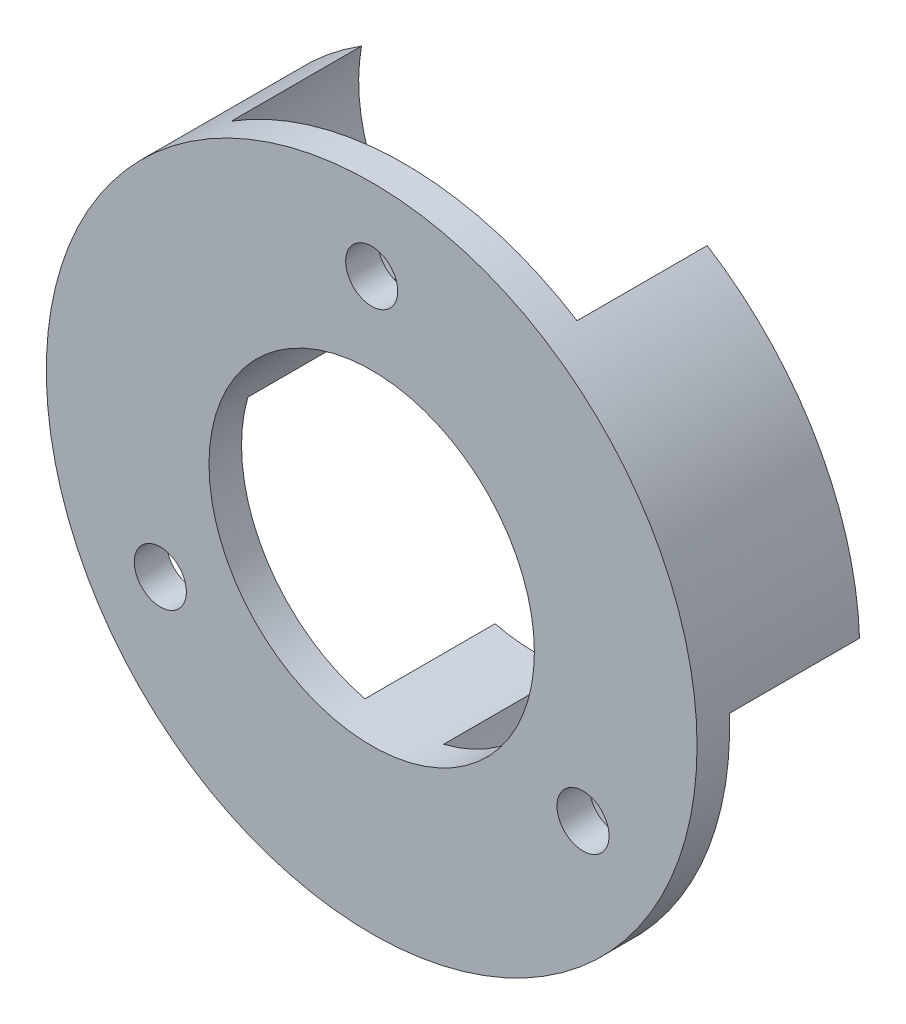
ISO-10303-21;
HEADER;
FILE_DESCRIPTION(('STEP AP214'),'2;1');
FILE_NAME('part.step','',(''),(''),'','','');
FILE_SCHEMA(('AUTOMOTIVE_DESIGN { 1 0 10303 214 1 1 1 1 }'));
ENDSEC;
DATA;
#1=APPLICATION_CONTEXT('core data for automotive mechanical design processes');
#2=APPLICATION_PROTOCOL_DEFINITION('international standard','automotive_design',2000,#1);
#3=PRODUCT_CONTEXT('',#1,'mechanical');
#4=PRODUCT('Part','Part','',(#3));
#5=PRODUCT_RELATED_PRODUCT_CATEGORY('part','',(#4));
#6=PRODUCT_DEFINITION_FORMATION('','',#4);
#7=PRODUCT_DEFINITION_CONTEXT('part definition',#1,'design');
#8=PRODUCT_DEFINITION('design','',#6,#7);
#9=PRODUCT_DEFINITION_SHAPE('','',#8);
#10=(LENGTH_UNIT() NAMED_UNIT(*) SI_UNIT(.MILLI.,.METRE.));
#11=(NAMED_UNIT(*) PLANE_ANGLE_UNIT() SI_UNIT($,.RADIAN.));
#12=(NAMED_UNIT(*) SI_UNIT($,.STERADIAN.) SOLID_ANGLE_UNIT());
#13=UNCERTAINTY_MEASURE_WITH_UNIT(LENGTH_MEASURE(1.E-05),#10,'distance_accuracy_value','');
#14=(GEOMETRIC_REPRESENTATION_CONTEXT(3) GLOBAL_UNCERTAINTY_ASSIGNED_CONTEXT((#13)) GLOBAL_UNIT_ASSIGNED_CONTEXT((#10,
#11,#12)) REPRESENTATION_CONTEXT('',''));
#15=CARTESIAN_POINT('',(0.,0.,0.));
#16=DIRECTION('',(0.,0.,1.));
#17=DIRECTION('',(1.,0.,0.));
#18=AXIS2_PLACEMENT_3D('',#15,#16,#17);
#19=CARTESIAN_POINT('',(0.,0.,0.));
#20=DIRECTION('',(0.,0.,1.));
#21=DIRECTION('',(1.,0.,0.));
#22=AXIS2_PLACEMENT_3D('',#19,#20,#21);
#23=PLANE('',#22);
#24=CARTESIAN_POINT('',(1.09461051334137E-12,18.75,0.));
#25=DIRECTION('',(0.,0.,-1.));
#26=DIRECTION('',(-1.,0.,0.));
#27=AXIS2_PLACEMENT_3D('',#24,#25,#26);
#28=CIRCLE('',#27,2.);
#29=CARTESIAN_POINT('',(-1.99999999999891,18.75,0.));
#30=VERTEX_POINT('',#29);
#31=EDGE_CURVE('E314',#30,#30,#28,.T.);
#32=ORIENTED_EDGE('',*,*,#31,.F.);
#33=EDGE_LOOP('',(#32));
#34=FACE_BOUND('',#33,.T.);
#35=CARTESIAN_POINT('',(1.09807996029332E-12,18.7499999999993,0.));
#36=DIRECTION('',(0.,0.,-1.));
#37=DIRECTION('',(-1.,0.,0.));
#38=AXIS2_PLACEMENT_3D('',#35,#36,#37);
#39=CIRCLE('',#38,13.5);
#40=CARTESIAN_POINT('',(13.2791941480743,21.181666666666,0.));
#41=VERTEX_POINT('',#40);
#42=CARTESIAN_POINT('',(8.9932565786207,8.68166666666577,0.));
#43=VERTEX_POINT('',#42);
#44=EDGE_CURVE('E139',#41,#43,#39,.T.);
#45=ORIENTED_EDGE('',*,*,#44,.T.);
#46=CARTESIAN_POINT('',(0.,0.,0.));
#47=DIRECTION('',(0.,0.,-1.));
#48=DIRECTION('',(-1.,0.,0.));
#49=AXIS2_PLACEMENT_3D('',#46,#47,#48);
#50=CIRCLE('',#49,12.5);
#51=CARTESIAN_POINT('',(-8.99325657861969,8.68166666666682,0.));
#52=VERTEX_POINT('',#51);
#53=EDGE_CURVE('E132',#52,#43,#50,.T.);
#54=ORIENTED_EDGE('',*,*,#53,.F.);
#55=CARTESIAN_POINT('',(1.09807996029332E-12,18.7499999999993,0.));
#56=DIRECTION('',(0.,0.,-1.));
#57=DIRECTION('',(-1.,0.,0.));
#58=AXIS2_PLACEMENT_3D('',#55,#56,#57);
#59=CIRCLE('',#58,13.5);
#60=CARTESIAN_POINT('',(-13.2791941480718,21.1816666666675,0.));
#61=VERTEX_POINT('',#60);
#62=EDGE_CURVE('E136',#52,#61,#59,.T.);
#63=ORIENTED_EDGE('',*,*,#62,.T.);
#64=CARTESIAN_POINT('',(0.,0.,0.));
#65=DIRECTION('',(0.,0.,1.));
#66=DIRECTION('',(1.,0.,0.));
#67=AXIS2_PLACEMENT_3D('',#64,#65,#66);
#68=CIRCLE('',#67,25.);
#69=EDGE_CURVE('E48',#41,#61,#68,.T.);
#70=ORIENTED_EDGE('',*,*,#69,.F.);
#71=EDGE_LOOP('',(#45,#54,#63,#70));
#72=FACE_BOUND('',#71,.T.);
#73=ADVANCED_FACE('F39',(#34,#72),#23,.F.);
#74=CARTESIAN_POINT('',(-16.2379763209587,-9.37499999999912,0.));
#75=DIRECTION('',(0.,0.,-1.));
#76=DIRECTION('',(-1.,0.,0.));
#77=AXIS2_PLACEMENT_3D('',#74,#75,#76);
#78=CIRCLE('',#77,2.);
#79=CARTESIAN_POINT('',(-18.2379763209587,-9.37499999999912,0.));
#80=VERTEX_POINT('',#79);
#81=EDGE_CURVE('E317',#80,#80,#78,.T.);
#82=ORIENTED_EDGE('',*,*,#81,.F.);
#83=EDGE_LOOP('',(#82));
#84=FACE_BOUND('',#83,.T.);
#85=CARTESIAN_POINT('',(-16.2379763209581,-9.37499999999878,0.));
#86=DIRECTION('',(0.,0.,-1.));
#87=DIRECTION('',(-1.,0.,0.));
#88=AXIS2_PLACEMENT_3D('',#85,#86,#87);
#89=CIRCLE('',#88,13.5);
#90=CARTESIAN_POINT('',(-24.983458501864,0.909286140684916,0.));
#91=VERTEX_POINT('',#90);
#92=CARTESIAN_POINT('',(-12.0151721698315,3.44755532650411,0.));
#93=VERTEX_POINT('',#92);
#94=EDGE_CURVE('E56',#91,#93,#89,.T.);
#95=ORIENTED_EDGE('',*,*,#94,.T.);
#96=CARTESIAN_POINT('',(-3.02191559121215,-12.1292219931696,0.));
#97=VERTEX_POINT('',#96);
#98=EDGE_CURVE('E145',#97,#93,#50,.T.);
#99=ORIENTED_EDGE('',*,*,#98,.F.);
#100=CARTESIAN_POINT('',(-16.2379763209581,-9.37499999999878,0.));
#101=DIRECTION('',(0.,0.,-1.));
#102=DIRECTION('',(-1.,0.,0.));
#103=AXIS2_PLACEMENT_3D('',#100,#101,#102);
#104=CIRCLE('',#103,13.5);
#105=CARTESIAN_POINT('',(-11.7042643537921,-22.0909528073497,0.));
#106=VERTEX_POINT('',#105);
#107=EDGE_CURVE('E178',#97,#106,#104,.T.);
#108=ORIENTED_EDGE('',*,*,#107,.T.);
#109=EDGE_CURVE('E224',#91,#106,#68,.T.);
#110=ORIENTED_EDGE('',*,*,#109,.F.);
#111=EDGE_LOOP('',(#95,#99,#108,#110));
#112=FACE_BOUND('',#111,.T.);
#113=ADVANCED_FACE('F282',(#84,#112),#23,.F.);
#114=CARTESIAN_POINT('',(16.2379763209576,-9.37500000000103,0.));
#115=DIRECTION('',(0.,0.,-1.));
#116=DIRECTION('',(-1.,0.,0.));
#117=AXIS2_PLACEMENT_3D('',#114,#115,#116);
#118=CIRCLE('',#117,2.);
#119=CARTESIAN_POINT('',(14.2379763209576,-9.37500000000103,0.));
#120=VERTEX_POINT('',#119);
#121=EDGE_CURVE('E229',#120,#120,#118,.T.);
#122=ORIENTED_EDGE('',*,*,#121,.F.);
#123=EDGE_LOOP('',(#122));
#124=FACE_BOUND('',#123,.T.);
#125=CARTESIAN_POINT('',(16.237976320957,-9.37500000000068,0.));
#126=DIRECTION('',(0.,0.,-1.));
#127=DIRECTION('',(-1.,0.,0.));
#128=AXIS2_PLACEMENT_3D('',#125,#126,#127);
#129=CIRCLE('',#128,13.5);
#130=CARTESIAN_POINT('',(11.7042643537895,-22.0909528073511,0.));
#131=VERTEX_POINT('',#130);
#132=CARTESIAN_POINT('',(3.02191559121072,-12.12922199317,0.));
#133=VERTEX_POINT('',#132);
#134=EDGE_CURVE('E64',#131,#133,#129,.T.);
#135=ORIENTED_EDGE('',*,*,#134,.T.);
#136=CARTESIAN_POINT('',(12.0151721698319,3.4475553265027,0.));
#137=VERTEX_POINT('',#136);
#138=EDGE_CURVE('E143',#137,#133,#50,.T.);
#139=ORIENTED_EDGE('',*,*,#138,.F.);
#140=CARTESIAN_POINT('',(16.237976320957,-9.37500000000068,0.));
#141=DIRECTION('',(0.,0.,-1.));
#142=DIRECTION('',(-1.,0.,0.));
#143=AXIS2_PLACEMENT_3D('',#140,#141,#142);
#144=CIRCLE('',#143,13.5);
#145=CARTESIAN_POINT('',(24.9834585018641,0.909286140681987,0.));
#146=VERTEX_POINT('',#145);
#147=EDGE_CURVE('E199',#137,#146,#144,.T.);
#148=ORIENTED_EDGE('',*,*,#147,.T.);
#149=EDGE_CURVE('E222',#131,#146,#68,.T.);
#150=ORIENTED_EDGE('',*,*,#149,.F.);
#151=EDGE_LOOP('',(#135,#139,#148,#150));
#152=FACE_BOUND('',#151,.T.);
#153=ADVANCED_FACE('F273',(#124,#152),#23,.F.);
#154=CARTESIAN_POINT('',(0.,0.,2.5));
#155=DIRECTION('',(0.,0.,-1.));
#156=DIRECTION('',(-1.,0.,0.));
#157=AXIS2_PLACEMENT_3D('',#154,#155,#156);
#158=CYLINDRICAL_SURFACE('',#157,25.);
#159=CARTESIAN_POINT('',(0.,0.,2.5));
#160=DIRECTION('',(0.,0.,1.));
#161=DIRECTION('',(1.,0.,0.));
#162=AXIS2_PLACEMENT_3D('',#159,#160,#161);
#163=CIRCLE('',#162,25.);
#164=CARTESIAN_POINT('',(25.,0.,2.5));
#165=VERTEX_POINT('',#164);
#166=EDGE_CURVE('E11',#165,#165,#163,.T.);
#167=ORIENTED_EDGE('',*,*,#166,.F.);
#168=EDGE_LOOP('',(#167));
#169=FACE_BOUND('',#168,.T.);
#170=ORIENTED_EDGE('',*,*,#69,.T.);
#171=DIRECTION('',(0.,0.,1.));
#172=VECTOR('',#171,1.);
#173=CARTESIAN_POINT('',(-13.2791941480718,21.1816666666675,-10.));
#174=LINE('',#173,#172);
#175=CARTESIAN_POINT('',(-13.2791941480718,21.1816666666675,-10.));
#176=VERTEX_POINT('',#175);
#177=EDGE_CURVE('E160',#176,#61,#174,.T.);
#178=ORIENTED_EDGE('',*,*,#177,.F.);
#179=CARTESIAN_POINT('',(0.,0.,-10.));
#180=DIRECTION('',(0.,0.,-1.));
#181=DIRECTION('',(-1.,0.,0.));
#182=AXIS2_PLACEMENT_3D('',#179,#180,#181);
#183=CIRCLE('',#182,25.);
#184=CARTESIAN_POINT('',(-24.983458501864,0.909286140684916,-10.));
#185=VERTEX_POINT('',#184);
#186=EDGE_CURVE('E167',#185,#176,#183,.T.);
#187=ORIENTED_EDGE('',*,*,#186,.F.);
#188=DIRECTION('',(0.,0.,1.));
#189=VECTOR('',#188,1.);
#190=CARTESIAN_POINT('',(-24.983458501864,0.909286140684916,-10.));
#191=LINE('',#190,#189);
#192=EDGE_CURVE('E171',#185,#91,#191,.T.);
#193=ORIENTED_EDGE('',*,*,#192,.T.);
#194=ORIENTED_EDGE('',*,*,#109,.T.);
#195=DIRECTION('',(0.,0.,1.));
#196=VECTOR('',#195,1.);
#197=CARTESIAN_POINT('',(-11.7042643537921,-22.0909528073497,-10.));
#198=LINE('',#197,#196);
#199=CARTESIAN_POINT('',(-11.7042643537921,-22.0909528073497,-10.));
#200=VERTEX_POINT('',#199);
#201=EDGE_CURVE('E192',#200,#106,#198,.T.);
#202=ORIENTED_EDGE('',*,*,#201,.F.);
#203=CARTESIAN_POINT('',(0.,0.,-10.));
#204=DIRECTION('',(0.,0.,-1.));
#205=DIRECTION('',(-1.,0.,0.));
#206=AXIS2_PLACEMENT_3D('',#203,#204,#205);
#207=CIRCLE('',#206,25.);
#208=CARTESIAN_POINT('',(11.7042643537895,-22.0909528073511,-10.));
#209=VERTEX_POINT('',#208);
#210=EDGE_CURVE('E181',#209,#200,#207,.T.);
#211=ORIENTED_EDGE('',*,*,#210,.F.);
#212=DIRECTION('',(0.,0.,1.));
#213=VECTOR('',#212,1.);
#214=CARTESIAN_POINT('',(11.7042643537895,-22.0909528073511,-10.));
#215=LINE('',#214,#213);
#216=EDGE_CURVE('E195',#209,#131,#215,.T.);
#217=ORIENTED_EDGE('',*,*,#216,.T.);
#218=ORIENTED_EDGE('',*,*,#149,.T.);
#219=DIRECTION('',(0.,0.,1.));
#220=VECTOR('',#219,1.);
#221=CARTESIAN_POINT('',(24.9834585018641,0.909286140681987,-10.));
#222=LINE('',#221,#220);
#223=CARTESIAN_POINT('',(24.9834585018641,0.909286140681987,-10.));
#224=VERTEX_POINT('',#223);
#225=EDGE_CURVE('E211',#224,#146,#222,.T.);
#226=ORIENTED_EDGE('',*,*,#225,.F.);
#227=CARTESIAN_POINT('',(0.,0.,-10.));
#228=DIRECTION('',(0.,0.,-1.));
#229=DIRECTION('',(-1.,0.,0.));
#230=AXIS2_PLACEMENT_3D('',#227,#228,#229);
#231=CIRCLE('',#230,25.);
#232=CARTESIAN_POINT('',(13.2791941480743,21.181666666666,-10.));
#233=VERTEX_POINT('',#232);
#234=EDGE_CURVE('E209',#233,#224,#231,.T.);
#235=ORIENTED_EDGE('',*,*,#234,.F.);
#236=DIRECTION('',(0.,0.,1.));
#237=VECTOR('',#236,1.);
#238=CARTESIAN_POINT('',(13.2791941480743,21.181666666666,-10.));
#239=LINE('',#238,#237);
#240=EDGE_CURVE('E217',#233,#41,#239,.T.);
#241=ORIENTED_EDGE('',*,*,#240,.T.);
#242=EDGE_LOOP('',(#170,#178,#187,#193,#194,#202,#211,#217,#218,#226,#235,#241));
#243=FACE_BOUND('',#242,.T.);
#244=ADVANCED_FACE('F41',(#169,#243),#158,.T.);
#245=CARTESIAN_POINT('',(0.,0.,2.5));
#246=DIRECTION('',(0.,0.,1.));
#247=DIRECTION('',(1.,0.,0.));
#248=AXIS2_PLACEMENT_3D('',#245,#246,#247);
#249=PLANE('',#248);
#250=CARTESIAN_POINT('',(16.2379763209576,-9.37500000000103,2.5));
#251=DIRECTION('',(0.,0.,1.));
#252=DIRECTION('',(1.,0.,0.));
#253=AXIS2_PLACEMENT_3D('',#250,#251,#252);
#254=CIRCLE('',#253,2.);
#255=CARTESIAN_POINT('',(18.2379763209576,-9.37500000000103,2.5));
#256=VERTEX_POINT('',#255);
#257=EDGE_CURVE('E43',#256,#256,#254,.T.);
#258=ORIENTED_EDGE('',*,*,#257,.F.);
#259=EDGE_LOOP('',(#258));
#260=FACE_BOUND('',#259,.T.);
#261=CARTESIAN_POINT('',(1.09461051334137E-12,18.75,2.5));
#262=DIRECTION('',(0.,0.,1.));
#263=DIRECTION('',(1.,0.,0.));
#264=AXIS2_PLACEMENT_3D('',#261,#262,#263);
#265=CIRCLE('',#264,2.);
#266=CARTESIAN_POINT('',(2.0000000000011,18.75,2.5));
#267=VERTEX_POINT('',#266);
#268=EDGE_CURVE('E228',#267,#267,#265,.T.);
#269=ORIENTED_EDGE('',*,*,#268,.F.);
#270=EDGE_LOOP('',(#269));
#271=FACE_BOUND('',#270,.T.);
#272=CARTESIAN_POINT('',(-16.2379763209587,-9.37499999999912,2.5));
#273=DIRECTION('',(0.,0.,1.));
#274=DIRECTION('',(1.,0.,0.));
#275=AXIS2_PLACEMENT_3D('',#272,#273,#274);
#276=CIRCLE('',#275,2.);
#277=CARTESIAN_POINT('',(-14.2379763209587,-9.37499999999912,2.5));
#278=VERTEX_POINT('',#277);
#279=EDGE_CURVE('E226',#278,#278,#276,.T.);
#280=ORIENTED_EDGE('',*,*,#279,.F.);
#281=EDGE_LOOP('',(#280));
#282=FACE_BOUND('',#281,.T.);
#283=CARTESIAN_POINT('',(0.,0.,2.5));
#284=DIRECTION('',(0.,0.,1.));
#285=DIRECTION('',(1.,0.,0.));
#286=AXIS2_PLACEMENT_3D('',#283,#284,#285);
#287=CIRCLE('',#286,12.5);
#288=CARTESIAN_POINT('',(12.5,0.,2.5));
#289=VERTEX_POINT('',#288);
#290=EDGE_CURVE('E142',#289,#289,#287,.T.);
#291=ORIENTED_EDGE('',*,*,#290,.F.);
#292=EDGE_LOOP('',(#291));
#293=FACE_BOUND('',#292,.T.);
#294=ORIENTED_EDGE('',*,*,#166,.T.);
#295=EDGE_LOOP('',(#294));
#296=FACE_BOUND('',#295,.T.);
#297=ADVANCED_FACE('F309',(#260,#271,#282,#293,#296),#249,.T.);
#298=CARTESIAN_POINT('',(16.237976320957,-9.37500000000068,-10.));
#299=DIRECTION('',(0.,0.,1.));
#300=DIRECTION('',(1.,0.,0.));
#301=AXIS2_PLACEMENT_3D('',#298,#299,#300);
#302=CYLINDRICAL_SURFACE('',#301,13.5);
#303=ORIENTED_EDGE('',*,*,#147,.F.);
#304=DIRECTION('',(0.,0.,1.));
#305=VECTOR('',#304,1.);
#306=CARTESIAN_POINT('',(12.0151721698319,3.4475553265027,-10.));
#307=LINE('',#306,#305);
#308=CARTESIAN_POINT('',(12.0151721698319,3.4475553265027,-10.));
#309=VERTEX_POINT('',#308);
#310=EDGE_CURVE('E221',#309,#137,#307,.T.);
#311=ORIENTED_EDGE('',*,*,#310,.F.);
#312=CARTESIAN_POINT('',(16.237976320957,-9.37500000000068,-10.));
#313=DIRECTION('',(0.,0.,-1.));
#314=DIRECTION('',(-1.,0.,0.));
#315=AXIS2_PLACEMENT_3D('',#312,#313,#314);
#316=CIRCLE('',#315,13.5);
#317=EDGE_CURVE('E200',#309,#224,#316,.T.);
#318=ORIENTED_EDGE('',*,*,#317,.T.);
#319=ORIENTED_EDGE('',*,*,#225,.T.);
#320=EDGE_LOOP('',(#303,#311,#318,#319));
#321=FACE_BOUND('',#320,.T.);
#322=ADVANCED_FACE('F267',(#321),#302,.F.);
#323=CARTESIAN_POINT('',(0.,0.,-10.));
#324=DIRECTION('',(0.,0.,1.));
#325=DIRECTION('',(1.,0.,0.));
#326=AXIS2_PLACEMENT_3D('',#323,#324,#325);
#327=CYLINDRICAL_SURFACE('',#326,12.5);
#328=ORIENTED_EDGE('',*,*,#310,.T.);
#329=ORIENTED_EDGE('',*,*,#138,.T.);
#330=DIRECTION('',(0.,0.,1.));
#331=VECTOR('',#330,1.);
#332=CARTESIAN_POINT('',(3.02191559121072,-12.12922199317,-10.));
#333=LINE('',#332,#331);
#334=CARTESIAN_POINT('',(3.02191559121072,-12.12922199317,-10.));
#335=VERTEX_POINT('',#334);
#336=EDGE_CURVE('E197',#335,#133,#333,.T.);
#337=ORIENTED_EDGE('',*,*,#336,.F.);
#338=CARTESIAN_POINT('',(0.,0.,-10.));
#339=DIRECTION('',(0.,0.,-1.));
#340=DIRECTION('',(-1.,0.,0.));
#341=AXIS2_PLACEMENT_3D('',#338,#339,#340);
#342=CIRCLE('',#341,12.5);
#343=CARTESIAN_POINT('',(-3.02191559121214,-12.1292219931696,-10.));
#344=VERTEX_POINT('',#343);
#345=EDGE_CURVE('E174',#335,#344,#342,.T.);
#346=ORIENTED_EDGE('',*,*,#345,.T.);
#347=DIRECTION('',(0.,0.,1.));
#348=VECTOR('',#347,1.);
#349=CARTESIAN_POINT('',(-3.02191559121214,-12.1292219931696,-10.));
#350=LINE('',#349,#348);
#351=EDGE_CURVE('E186',#344,#97,#350,.T.);
#352=ORIENTED_EDGE('',*,*,#351,.T.);
#353=ORIENTED_EDGE('',*,*,#98,.T.);
#354=DIRECTION('',(0.,0.,1.));
#355=VECTOR('',#354,1.);
#356=CARTESIAN_POINT('',(-12.0151721698315,3.44755532650411,-10.));
#357=LINE('',#356,#355);
#358=CARTESIAN_POINT('',(-12.0151721698315,3.44755532650411,-10.));
#359=VERTEX_POINT('',#358);
#360=EDGE_CURVE('E156',#359,#93,#357,.T.);
#361=ORIENTED_EDGE('',*,*,#360,.F.);
#362=CARTESIAN_POINT('',(0.,0.,-10.));
#363=DIRECTION('',(0.,0.,-1.));
#364=DIRECTION('',(-1.,0.,0.));
#365=AXIS2_PLACEMENT_3D('',#362,#363,#364);
#366=CIRCLE('',#365,12.5);
#367=CARTESIAN_POINT('',(-8.99325657861968,8.68166666666682,-10.));
#368=VERTEX_POINT('',#367);
#369=EDGE_CURVE('E152',#359,#368,#366,.T.);
#370=ORIENTED_EDGE('',*,*,#369,.T.);
#371=DIRECTION('',(0.,0.,1.));
#372=VECTOR('',#371,1.);
#373=CARTESIAN_POINT('',(-8.99325657861968,8.68166666666682,-10.));
#374=LINE('',#373,#372);
#375=EDGE_CURVE('E147',#368,#52,#374,.T.);
#376=ORIENTED_EDGE('',*,*,#375,.T.);
#377=ORIENTED_EDGE('',*,*,#53,.T.);
#378=DIRECTION('',(0.,0.,1.));
#379=VECTOR('',#378,1.);
#380=CARTESIAN_POINT('',(8.99325657862071,8.68166666666577,-10.));
#381=LINE('',#380,#379);
#382=CARTESIAN_POINT('',(8.99325657862071,8.68166666666577,-10.));
#383=VERTEX_POINT('',#382);
#384=EDGE_CURVE('E219',#383,#43,#381,.T.);
#385=ORIENTED_EDGE('',*,*,#384,.F.);
#386=CARTESIAN_POINT('',(0.,0.,-10.));
#387=DIRECTION('',(0.,0.,-1.));
#388=DIRECTION('',(-1.,0.,0.));
#389=AXIS2_PLACEMENT_3D('',#386,#387,#388);
#390=CIRCLE('',#389,12.5);
#391=EDGE_CURVE('E203',#383,#309,#390,.T.);
#392=ORIENTED_EDGE('',*,*,#391,.T.);
#393=EDGE_LOOP('',(#328,#329,#337,#346,#352,#353,#361,#370,#376,#377,#385,#392));
#394=FACE_BOUND('',#393,.T.);
#395=ORIENTED_EDGE('',*,*,#290,.T.);
#396=EDGE_LOOP('',(#395));
#397=FACE_BOUND('',#396,.T.);
#398=ADVANCED_FACE('F149',(#394,#397),#327,.F.);
#399=CARTESIAN_POINT('',(1.09807996029332E-12,18.7499999999993,-10.));
#400=DIRECTION('',(0.,0.,1.));
#401=DIRECTION('',(1.,0.,0.));
#402=AXIS2_PLACEMENT_3D('',#399,#400,#401);
#403=CYLINDRICAL_SURFACE('',#402,13.5);
#404=ORIENTED_EDGE('',*,*,#44,.F.);
#405=ORIENTED_EDGE('',*,*,#240,.F.);
#406=CARTESIAN_POINT('',(1.09807996029332E-12,18.7499999999993,-10.));
#407=DIRECTION('',(0.,0.,-1.));
#408=DIRECTION('',(-1.,0.,0.));
#409=AXIS2_PLACEMENT_3D('',#406,#407,#408);
#410=CIRCLE('',#409,13.5);
#411=EDGE_CURVE('E206',#233,#383,#410,.T.);
#412=ORIENTED_EDGE('',*,*,#411,.T.);
#413=ORIENTED_EDGE('',*,*,#384,.T.);
#414=EDGE_LOOP('',(#404,#405,#412,#413));
#415=FACE_BOUND('',#414,.T.);
#416=ADVANCED_FACE('F260',(#415),#403,.F.);
#417=CARTESIAN_POINT('',(0.,0.,-10.));
#418=DIRECTION('',(0.,0.,-1.));
#419=DIRECTION('',(-1.,0.,0.));
#420=AXIS2_PLACEMENT_3D('',#417,#418,#419);
#421=PLANE('',#420);
#422=CARTESIAN_POINT('',(16.2379763209588,9.37499999999819,-10.));
#423=DIRECTION('',(0.,0.,-1.));
#424=DIRECTION('',(-1.,0.,0.));
#425=AXIS2_PLACEMENT_3D('',#422,#423,#424);
#426=CIRCLE('',#425,2.00000000000066);
#427=CARTESIAN_POINT('',(14.2379763209581,9.37499999999819,-10.));
#428=VERTEX_POINT('',#427);
#429=EDGE_CURVE('E238',#428,#428,#426,.T.);
#430=ORIENTED_EDGE('',*,*,#429,.F.);
#431=EDGE_LOOP('',(#430));
#432=FACE_BOUND('',#431,.T.);
#433=ORIENTED_EDGE('',*,*,#317,.F.);
#434=ORIENTED_EDGE('',*,*,#391,.F.);
#435=ORIENTED_EDGE('',*,*,#411,.F.);
#436=ORIENTED_EDGE('',*,*,#234,.T.);
#437=EDGE_LOOP('',(#433,#434,#435,#436));
#438=FACE_BOUND('',#437,.T.);
#439=ADVANCED_FACE('F264',(#432,#438),#421,.T.);
#440=CARTESIAN_POINT('',(16.237976320957,-9.37500000000068,-10.));
#441=DIRECTION('',(0.,0.,1.));
#442=DIRECTION('',(1.,0.,0.));
#443=AXIS2_PLACEMENT_3D('',#440,#441,#442);
#444=CYLINDRICAL_SURFACE('',#443,13.5);
#445=ORIENTED_EDGE('',*,*,#134,.F.);
#446=ORIENTED_EDGE('',*,*,#216,.F.);
#447=CARTESIAN_POINT('',(16.237976320957,-9.37500000000068,-10.));
#448=DIRECTION('',(0.,0.,-1.));
#449=DIRECTION('',(-1.,0.,0.));
#450=AXIS2_PLACEMENT_3D('',#447,#448,#449);
#451=CIRCLE('',#450,13.5);
#452=EDGE_CURVE('E177',#209,#335,#451,.T.);
#453=ORIENTED_EDGE('',*,*,#452,.T.);
#454=ORIENTED_EDGE('',*,*,#336,.T.);
#455=EDGE_LOOP('',(#445,#446,#453,#454));
#456=FACE_BOUND('',#455,.T.);
#457=ADVANCED_FACE('F270',(#456),#444,.F.);
#458=CARTESIAN_POINT('',(-16.2379763209581,-9.37499999999878,-10.));
#459=DIRECTION('',(0.,0.,1.));
#460=DIRECTION('',(1.,0.,0.));
#461=AXIS2_PLACEMENT_3D('',#458,#459,#460);
#462=CYLINDRICAL_SURFACE('',#461,13.5);
#463=ORIENTED_EDGE('',*,*,#107,.F.);
#464=ORIENTED_EDGE('',*,*,#351,.F.);
#465=CARTESIAN_POINT('',(-16.2379763209581,-9.37499999999878,-10.));
#466=DIRECTION('',(0.,0.,-1.));
#467=DIRECTION('',(-1.,0.,0.));
#468=AXIS2_PLACEMENT_3D('',#465,#466,#467);
#469=CIRCLE('',#468,13.5);
#470=EDGE_CURVE('E183',#344,#200,#469,.T.);
#471=ORIENTED_EDGE('',*,*,#470,.T.);
#472=ORIENTED_EDGE('',*,*,#201,.T.);
#473=EDGE_LOOP('',(#463,#464,#471,#472));
#474=FACE_BOUND('',#473,.T.);
#475=ADVANCED_FACE('F280',(#474),#462,.F.);
#476=CARTESIAN_POINT('',(0.,0.,-10.));
#477=DIRECTION('',(0.,0.,-1.));
#478=DIRECTION('',(-1.,0.,0.));
#479=AXIS2_PLACEMENT_3D('',#476,#477,#478);
#480=PLANE('',#479);
#481=CARTESIAN_POINT('',(-1.84256534506425E-12,-18.7500000000005,-10.));
#482=DIRECTION('',(0.,0.,-1.));
#483=DIRECTION('',(-1.,0.,0.));
#484=AXIS2_PLACEMENT_3D('',#481,#482,#483);
#485=CIRCLE('',#484,1.99999999999976);
#486=CARTESIAN_POINT('',(-2.0000000000016,-18.7500000000005,-10.));
#487=VERTEX_POINT('',#486);
#488=EDGE_CURVE('E327',#487,#487,#485,.T.);
#489=ORIENTED_EDGE('',*,*,#488,.F.);
#490=EDGE_LOOP('',(#489));
#491=FACE_BOUND('',#490,.T.);
#492=ORIENTED_EDGE('',*,*,#345,.F.);
#493=ORIENTED_EDGE('',*,*,#452,.F.);
#494=ORIENTED_EDGE('',*,*,#210,.T.);
#495=ORIENTED_EDGE('',*,*,#470,.F.);
#496=EDGE_LOOP('',(#492,#493,#494,#495));
#497=FACE_BOUND('',#496,.T.);
#498=ADVANCED_FACE('F284',(#491,#497),#480,.T.);
#499=CARTESIAN_POINT('',(1.09807996029332E-12,18.7499999999993,-10.));
#500=DIRECTION('',(0.,0.,1.));
#501=DIRECTION('',(1.,0.,0.));
#502=AXIS2_PLACEMENT_3D('',#499,#500,#501);
#503=CYLINDRICAL_SURFACE('',#502,13.5);
#504=ORIENTED_EDGE('',*,*,#62,.F.);
#505=ORIENTED_EDGE('',*,*,#375,.F.);
#506=CARTESIAN_POINT('',(1.09807996029332E-12,18.7499999999993,-10.));
#507=DIRECTION('',(0.,0.,-1.));
#508=DIRECTION('',(-1.,0.,0.));
#509=AXIS2_PLACEMENT_3D('',#506,#507,#508);
#510=CIRCLE('',#509,13.5);
#511=EDGE_CURVE('E162',#368,#176,#510,.T.);
#512=ORIENTED_EDGE('',*,*,#511,.T.);
#513=ORIENTED_EDGE('',*,*,#177,.T.);
#514=EDGE_LOOP('',(#504,#505,#512,#513));
#515=FACE_BOUND('',#514,.T.);
#516=ADVANCED_FACE('F158',(#515),#503,.F.);
#517=CARTESIAN_POINT('',(-16.2379763209581,-9.37499999999878,-10.));
#518=DIRECTION('',(0.,0.,1.));
#519=DIRECTION('',(1.,0.,0.));
#520=AXIS2_PLACEMENT_3D('',#517,#518,#519);
#521=CYLINDRICAL_SURFACE('',#520,13.5);
#522=ORIENTED_EDGE('',*,*,#94,.F.);
#523=ORIENTED_EDGE('',*,*,#192,.F.);
#524=CARTESIAN_POINT('',(-16.2379763209581,-9.37499999999878,-10.));
#525=DIRECTION('',(0.,0.,-1.));
#526=DIRECTION('',(-1.,0.,0.));
#527=AXIS2_PLACEMENT_3D('',#524,#525,#526);
#528=CIRCLE('',#527,13.5);
#529=EDGE_CURVE('E249',#185,#359,#528,.T.);
#530=ORIENTED_EDGE('',*,*,#529,.T.);
#531=ORIENTED_EDGE('',*,*,#360,.T.);
#532=EDGE_LOOP('',(#522,#523,#530,#531));
#533=FACE_BOUND('',#532,.T.);
#534=ADVANCED_FACE('F292',(#533),#521,.F.);
#535=CARTESIAN_POINT('',(0.,0.,-10.));
#536=DIRECTION('',(0.,0.,-1.));
#537=DIRECTION('',(-1.,0.,0.));
#538=AXIS2_PLACEMENT_3D('',#535,#536,#537);
#539=PLANE('',#538);
#540=CARTESIAN_POINT('',(-16.2379763209577,9.37500000000092,-10.));
#541=DIRECTION('',(0.,0.,-1.));
#542=DIRECTION('',(-1.,0.,0.));
#543=AXIS2_PLACEMENT_3D('',#540,#541,#542);
#544=CIRCLE('',#543,2.);
#545=CARTESIAN_POINT('',(-18.2379763209577,9.37500000000092,-10.));
#546=VERTEX_POINT('',#545);
#547=EDGE_CURVE('E324',#546,#546,#544,.T.);
#548=ORIENTED_EDGE('',*,*,#547,.F.);
#549=EDGE_LOOP('',(#548));
#550=FACE_BOUND('',#549,.T.);
#551=ORIENTED_EDGE('',*,*,#511,.F.);
#552=ORIENTED_EDGE('',*,*,#369,.F.);
#553=ORIENTED_EDGE('',*,*,#529,.F.);
#554=ORIENTED_EDGE('',*,*,#186,.T.);
#555=EDGE_LOOP('',(#551,#552,#553,#554));
#556=FACE_BOUND('',#555,.T.);
#557=ADVANCED_FACE('F254',(#550,#556),#539,.T.);
#558=CARTESIAN_POINT('',(-16.2379763209577,9.37500000000092,-4.));
#559=DIRECTION('',(0.,0.,-1.));
#560=DIRECTION('',(-1.,0.,0.));
#561=AXIS2_PLACEMENT_3D('',#558,#559,#560);
#562=CYLINDRICAL_SURFACE('',#561,2.);
#563=CARTESIAN_POINT('',(-16.2379763209577,9.37500000000092,-4.));
#564=DIRECTION('',(0.,0.,-1.));
#565=DIRECTION('',(-1.,0.,0.));
#566=AXIS2_PLACEMENT_3D('',#563,#564,#565);
#567=CIRCLE('',#566,2.);
#568=CARTESIAN_POINT('',(-18.2379763209577,9.37500000000092,-4.));
#569=VERTEX_POINT('',#568);
#570=EDGE_CURVE('E247',#569,#569,#567,.T.);
#571=ORIENTED_EDGE('',*,*,#570,.F.);
#572=EDGE_LOOP('',(#571));
#573=FACE_BOUND('',#572,.T.);
#574=ORIENTED_EDGE('',*,*,#547,.T.);
#575=EDGE_LOOP('',(#574));
#576=FACE_BOUND('',#575,.T.);
#577=ADVANCED_FACE('F345',(#573,#576),#562,.F.);
#578=CARTESIAN_POINT('',(-16.2379763209577,9.37500000000092,-4.));
#579=DIRECTION('',(0.,0.,-1.));
#580=DIRECTION('',(-1.,0.,0.));
#581=AXIS2_PLACEMENT_3D('',#578,#579,#580);
#582=PLANE('',#581);
#583=ORIENTED_EDGE('',*,*,#570,.T.);
#584=EDGE_LOOP('',(#583));
#585=FACE_BOUND('',#584,.T.);
#586=ADVANCED_FACE('F337',(#585),#582,.T.);
#587=CARTESIAN_POINT('',(-1.84256534506425E-12,-18.7500000000005,-4.));
#588=DIRECTION('',(0.,0.,-1.));
#589=DIRECTION('',(-1.,0.,0.));
#590=AXIS2_PLACEMENT_3D('',#587,#588,#589);
#591=CYLINDRICAL_SURFACE('',#590,1.99999999999976);
#592=CARTESIAN_POINT('',(-1.84256534506425E-12,-18.7500000000005,-4.));
#593=DIRECTION('',(0.,0.,-1.));
#594=DIRECTION('',(-1.,0.,0.));
#595=AXIS2_PLACEMENT_3D('',#592,#593,#594);
#596=CIRCLE('',#595,1.99999999999976);
#597=CARTESIAN_POINT('',(-2.0000000000016,-18.7500000000005,-4.));
#598=VERTEX_POINT('',#597);
#599=EDGE_CURVE('E243',#598,#598,#596,.T.);
#600=ORIENTED_EDGE('',*,*,#599,.F.);
#601=EDGE_LOOP('',(#600));
#602=FACE_BOUND('',#601,.T.);
#603=ORIENTED_EDGE('',*,*,#488,.T.);
#604=EDGE_LOOP('',(#603));
#605=FACE_BOUND('',#604,.T.);
#606=ADVANCED_FACE('F334',(#602,#605),#591,.F.);
#607=CARTESIAN_POINT('',(-1.84256534506425E-12,-18.7500000000005,-4.));
#608=DIRECTION('',(0.,0.,-1.));
#609=DIRECTION('',(-1.,0.,0.));
#610=AXIS2_PLACEMENT_3D('',#607,#608,#609);
#611=PLANE('',#610);
#612=ORIENTED_EDGE('',*,*,#599,.T.);
#613=EDGE_LOOP('',(#612));
#614=FACE_BOUND('',#613,.T.);
#615=ADVANCED_FACE('F332',(#614),#611,.T.);
#616=CARTESIAN_POINT('',(16.2379763209588,9.37499999999819,-4.));
#617=DIRECTION('',(0.,0.,-1.));
#618=DIRECTION('',(-1.,0.,0.));
#619=AXIS2_PLACEMENT_3D('',#616,#617,#618);
#620=CYLINDRICAL_SURFACE('',#619,2.00000000000066);
#621=CARTESIAN_POINT('',(16.2379763209588,9.37499999999819,-4.));
#622=DIRECTION('',(0.,0.,-1.));
#623=DIRECTION('',(-1.,0.,0.));
#624=AXIS2_PLACEMENT_3D('',#621,#622,#623);
#625=CIRCLE('',#624,2.00000000000066);
#626=CARTESIAN_POINT('',(14.2379763209581,9.37499999999819,-4.));
#627=VERTEX_POINT('',#626);
#628=EDGE_CURVE('E234',#627,#627,#625,.T.);
#629=ORIENTED_EDGE('',*,*,#628,.F.);
#630=EDGE_LOOP('',(#629));
#631=FACE_BOUND('',#630,.T.);
#632=ORIENTED_EDGE('',*,*,#429,.T.);
#633=EDGE_LOOP('',(#632));
#634=FACE_BOUND('',#633,.T.);
#635=ADVANCED_FACE('F343',(#631,#634),#620,.F.);
#636=CARTESIAN_POINT('',(16.2379763209588,9.37499999999819,-4.));
#637=DIRECTION('',(0.,0.,-1.));
#638=DIRECTION('',(-1.,0.,0.));
#639=AXIS2_PLACEMENT_3D('',#636,#637,#638);
#640=PLANE('',#639);
#641=ORIENTED_EDGE('',*,*,#628,.T.);
#642=EDGE_LOOP('',(#641));
#643=FACE_BOUND('',#642,.T.);
#644=ADVANCED_FACE('F352',(#643),#640,.T.);
#645=CARTESIAN_POINT('',(-16.2379763209587,-9.37499999999912,6.));
#646=DIRECTION('',(0.,0.,-1.));
#647=DIRECTION('',(-1.,0.,0.));
#648=AXIS2_PLACEMENT_3D('',#645,#646,#647);
#649=CYLINDRICAL_SURFACE('',#648,2.);
#650=ORIENTED_EDGE('',*,*,#279,.T.);
#651=EDGE_LOOP('',(#650));
#652=FACE_BOUND('',#651,.T.);
#653=ORIENTED_EDGE('',*,*,#81,.T.);
#654=EDGE_LOOP('',(#653));
#655=FACE_BOUND('',#654,.T.);
#656=ADVANCED_FACE('F356',(#652,#655),#649,.F.);
#657=CARTESIAN_POINT('',(1.09461051334137E-12,18.75,6.));
#658=DIRECTION('',(0.,0.,-1.));
#659=DIRECTION('',(-1.,0.,0.));
#660=AXIS2_PLACEMENT_3D('',#657,#658,#659);
#661=CYLINDRICAL_SURFACE('',#660,2.);
#662=ORIENTED_EDGE('',*,*,#268,.T.);
#663=EDGE_LOOP('',(#662));
#664=FACE_BOUND('',#663,.T.);
#665=ORIENTED_EDGE('',*,*,#31,.T.);
#666=EDGE_LOOP('',(#665));
#667=FACE_BOUND('',#666,.T.);
#668=ADVANCED_FACE('F446',(#664,#667),#661,.F.);
#669=CARTESIAN_POINT('',(16.2379763209576,-9.37500000000103,6.));
#670=DIRECTION('',(0.,0.,-1.));
#671=DIRECTION('',(-1.,0.,0.));
#672=AXIS2_PLACEMENT_3D('',#669,#670,#671);
#673=CYLINDRICAL_SURFACE('',#672,2.);
#674=ORIENTED_EDGE('',*,*,#257,.T.);
#675=EDGE_LOOP('',(#674));
#676=FACE_BOUND('',#675,.T.);
#677=ORIENTED_EDGE('',*,*,#121,.T.);
#678=EDGE_LOOP('',(#677));
#679=FACE_BOUND('',#678,.T.);
#680=ADVANCED_FACE('F457',(#676,#679),#673,.F.);
#681=CLOSED_SHELL('',(#73,#113,#153,#244,#297,#322,#398,#416,#439,#457,#475,#498,#516,#534,#557,
#577,#586,#606,#615,#635,#644,#656,#668,#680));
#682=MANIFOLD_SOLID_BREP('B2',#681);
#683=ADVANCED_BREP_SHAPE_REPRESENTATION('',(#18,#682),#14);
#684=SHAPE_DEFINITION_REPRESENTATION(#9,#683);
ENDSEC;
END-ISO-10303-21;
